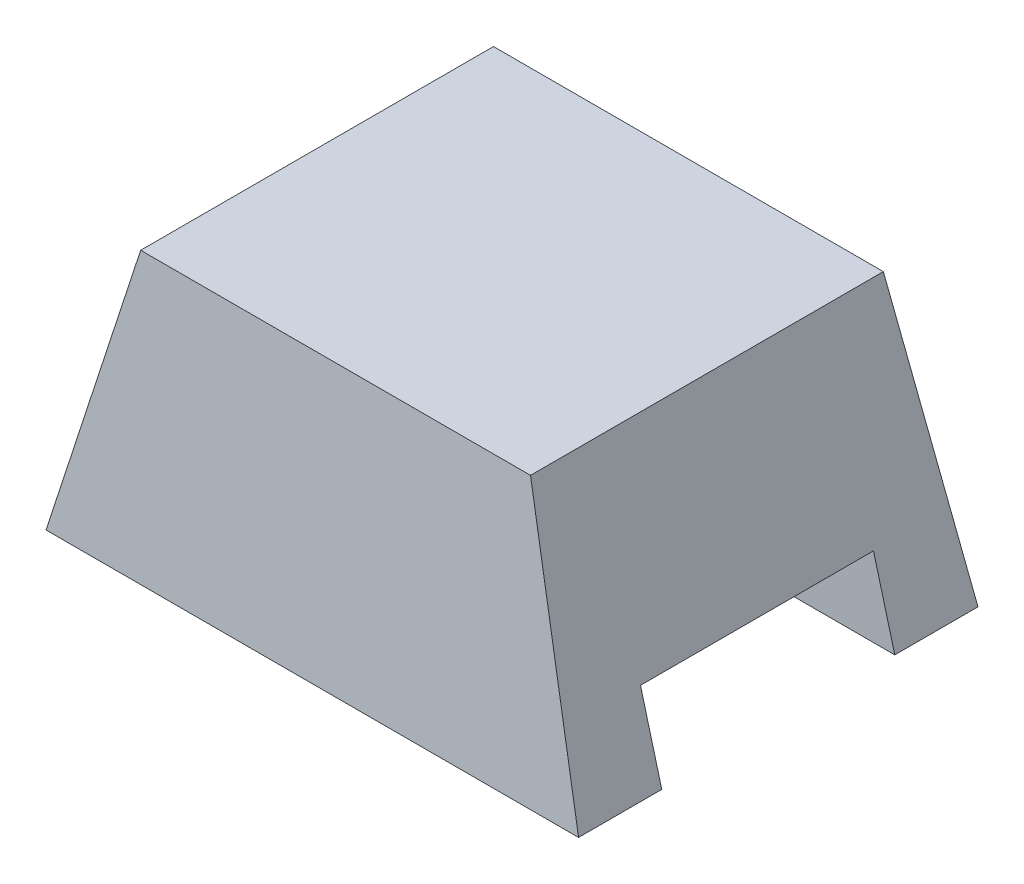
ISO-10303-21;
HEADER;
FILE_DESCRIPTION(('STEP AP214'),'2;1');
FILE_NAME('part.step','',(''),(''),'','','');
FILE_SCHEMA(('AUTOMOTIVE_DESIGN { 1 0 10303 214 1 1 1 1 }'));
ENDSEC;
DATA;
#1=APPLICATION_CONTEXT('core data for automotive mechanical design processes');
#2=APPLICATION_PROTOCOL_DEFINITION('international standard','automotive_design',2000,#1);
#3=PRODUCT_CONTEXT('',#1,'mechanical');
#4=PRODUCT('Part','Part','',(#3));
#5=PRODUCT_RELATED_PRODUCT_CATEGORY('part','',(#4));
#6=PRODUCT_DEFINITION_FORMATION('','',#4);
#7=PRODUCT_DEFINITION_CONTEXT('part definition',#1,'design');
#8=PRODUCT_DEFINITION('design','',#6,#7);
#9=PRODUCT_DEFINITION_SHAPE('','',#8);
#10=(LENGTH_UNIT() NAMED_UNIT(*) SI_UNIT(.MILLI.,.METRE.));
#11=(NAMED_UNIT(*) PLANE_ANGLE_UNIT() SI_UNIT($,.RADIAN.));
#12=(NAMED_UNIT(*) SI_UNIT($,.STERADIAN.) SOLID_ANGLE_UNIT());
#13=UNCERTAINTY_MEASURE_WITH_UNIT(LENGTH_MEASURE(1.E-05),#10,'distance_accuracy_value','');
#14=(GEOMETRIC_REPRESENTATION_CONTEXT(3) GLOBAL_UNCERTAINTY_ASSIGNED_CONTEXT((#13)) GLOBAL_UNIT_ASSIGNED_CONTEXT((#10,
#11,#12)) REPRESENTATION_CONTEXT('',''));
#15=CARTESIAN_POINT('',(0.,0.,0.));
#16=DIRECTION('',(0.,0.,1.));
#17=DIRECTION('',(1.,0.,0.));
#18=AXIS2_PLACEMENT_3D('',#15,#16,#17);
#19=CARTESIAN_POINT('',(0.,0.,60.));
#20=DIRECTION('',(0.,1.,0.));
#21=DIRECTION('',(0.,0.,1.));
#22=AXIS2_PLACEMENT_3D('',#19,#20,#21);
#23=PLANE('',#22);
#24=DIRECTION('',(0.,0.,-1.));
#25=VECTOR('',#24,1.);
#26=CARTESIAN_POINT('',(0.,0.,60.));
#27=LINE('',#26,#25);
#28=CARTESIAN_POINT('',(0.,0.,60.));
#29=VERTEX_POINT('',#28);
#30=CARTESIAN_POINT('',(0.,0.,47.5));
#31=VERTEX_POINT('',#30);
#32=EDGE_CURVE('E102',#29,#31,#27,.T.);
#33=ORIENTED_EDGE('',*,*,#32,.T.);
#34=DIRECTION('',(1.,0.,0.));
#35=VECTOR('',#34,1.);
#36=CARTESIAN_POINT('',(0.,0.,47.5));
#37=LINE('',#36,#35);
#38=CARTESIAN_POINT('',(80.,0.,47.5));
#39=VERTEX_POINT('',#38);
#40=EDGE_CURVE('E11',#31,#39,#37,.T.);
#41=ORIENTED_EDGE('',*,*,#40,.T.);
#42=DIRECTION('',(0.,0.,-1.));
#43=VECTOR('',#42,1.);
#44=CARTESIAN_POINT('',(80.,0.,60.));
#45=LINE('',#44,#43);
#46=CARTESIAN_POINT('',(80.,0.,60.));
#47=VERTEX_POINT('',#46);
#48=EDGE_CURVE('E117',#47,#39,#45,.T.);
#49=ORIENTED_EDGE('',*,*,#48,.F.);
#50=DIRECTION('',(1.,0.,0.));
#51=VECTOR('',#50,1.);
#52=CARTESIAN_POINT('',(0.,0.,60.));
#53=LINE('',#52,#51);
#54=EDGE_CURVE('E57',#29,#47,#53,.T.);
#55=ORIENTED_EDGE('',*,*,#54,.F.);
#56=EDGE_LOOP('',(#33,#41,#49,#55));
#57=FACE_BOUND('',#56,.T.);
#58=ADVANCED_FACE('F33',(#57),#23,.F.);
#59=CARTESIAN_POINT('',(80.,0.,60.));
#60=DIRECTION('',(0.965925826289068,0.258819045102521,0.));
#61=DIRECTION('',(-0.258819045102521,0.965925826289068,0.));
#62=AXIS2_PLACEMENT_3D('',#59,#60,#61);
#63=PLANE('',#62);
#64=ORIENTED_EDGE('',*,*,#48,.T.);
#65=DIRECTION('',(0.258819045102521,-0.965925826289068,0.));
#66=VECTOR('',#65,1.);
#67=CARTESIAN_POINT('',(80.,0.,47.5));
#68=LINE('',#67,#66);
#69=CARTESIAN_POINT('',(76.8005633720568,11.9404600510809,47.5));
#70=VERTEX_POINT('',#69);
#71=EDGE_CURVE('E155',#39,#70,#68,.F.);
#72=ORIENTED_EDGE('',*,*,#71,.T.);
#73=DIRECTION('',(0.,0.,1.));
#74=VECTOR('',#73,1.);
#75=CARTESIAN_POINT('',(76.8005633720568,11.9404600510809,60.));
#76=LINE('',#75,#74);
#77=CARTESIAN_POINT('',(76.8005633720568,11.9404600510809,12.5));
#78=VERTEX_POINT('',#77);
#79=EDGE_CURVE('E109',#70,#78,#76,.F.);
#80=ORIENTED_EDGE('',*,*,#79,.T.);
#81=DIRECTION('',(-0.258819045102521,0.965925826289068,0.));
#82=VECTOR('',#81,1.);
#83=CARTESIAN_POINT('',(80.,0.,12.5));
#84=LINE('',#83,#82);
#85=CARTESIAN_POINT('',(80.,0.,12.5));
#86=VERTEX_POINT('',#85);
#87=EDGE_CURVE('E151',#78,#86,#84,.F.);
#88=ORIENTED_EDGE('',*,*,#87,.T.);
#89=CARTESIAN_POINT('',(80.,0.,0.));
#90=VERTEX_POINT('',#89);
#91=EDGE_CURVE('E115',#86,#90,#45,.T.);
#92=ORIENTED_EDGE('',*,*,#91,.T.);
#93=DIRECTION('',(-0.257899784197096,0.962495097884607,0.0842074097641779));
#94=VECTOR('',#93,1.);
#95=CARTESIAN_POINT('',(78.6969756316413,4.8629531462149,0.425453271551524));
#96=LINE('',#95,#94);
#97=CARTESIAN_POINT('',(69.2820323027551,40.,3.49954654103696));
#98=VERTEX_POINT('',#97);
#99=EDGE_CURVE('E100',#90,#98,#96,.T.);
#100=ORIENTED_EDGE('',*,*,#99,.T.);
#101=DIRECTION('',(0.,0.,1.));
#102=VECTOR('',#101,1.);
#103=CARTESIAN_POINT('',(69.2820323027551,40.,60.));
#104=LINE('',#103,#102);
#105=CARTESIAN_POINT('',(69.2820323027551,40.,56.500453458963));
#106=VERTEX_POINT('',#105);
#107=EDGE_CURVE('E85',#106,#98,#104,.F.);
#108=ORIENTED_EDGE('',*,*,#107,.F.);
#109=DIRECTION('',(0.257899784197096,-0.962495097884607,0.0842074097641779));
#110=VECTOR('',#109,1.);
#111=CARTESIAN_POINT('',(80.,0.,60.));
#112=LINE('',#111,#110);
#113=EDGE_CURVE('E91',#47,#106,#112,.F.);
#114=ORIENTED_EDGE('',*,*,#113,.F.);
#115=EDGE_LOOP('',(#64,#72,#80,#88,#92,#100,#108,#114));
#116=FACE_BOUND('',#115,.T.);
#117=ADVANCED_FACE('F98',(#116),#63,.T.);
#118=CARTESIAN_POINT('',(80.,40.,60.));
#119=DIRECTION('',(0.,-1.,0.));
#120=DIRECTION('',(1.,0.,0.));
#121=AXIS2_PLACEMENT_3D('',#118,#119,#120);
#122=PLANE('',#121);
#123=DIRECTION('',(1.,0.,0.));
#124=VECTOR('',#123,1.);
#125=CARTESIAN_POINT('',(80.,40.,3.49954654103696));
#126=LINE('',#125,#124);
#127=CARTESIAN_POINT('',(10.7179676972449,40.,3.49954654103696));
#128=VERTEX_POINT('',#127);
#129=EDGE_CURVE('E108',#98,#128,#126,.F.);
#130=ORIENTED_EDGE('',*,*,#129,.T.);
#131=DIRECTION('',(0.,0.,1.));
#132=VECTOR('',#131,1.);
#133=CARTESIAN_POINT('',(10.7179676972449,40.,60.));
#134=LINE('',#133,#132);
#135=CARTESIAN_POINT('',(10.7179676972449,40.,56.500453458963));
#136=VERTEX_POINT('',#135);
#137=EDGE_CURVE('E88',#136,#128,#134,.F.);
#138=ORIENTED_EDGE('',*,*,#137,.F.);
#139=DIRECTION('',(-1.,0.,0.));
#140=VECTOR('',#139,1.);
#141=CARTESIAN_POINT('',(80.,40.,56.500453458963));
#142=LINE('',#141,#140);
#143=EDGE_CURVE('E82',#106,#136,#142,.T.);
#144=ORIENTED_EDGE('',*,*,#143,.F.);
#145=ORIENTED_EDGE('',*,*,#107,.T.);
#146=EDGE_LOOP('',(#130,#138,#144,#145));
#147=FACE_BOUND('',#146,.T.);
#148=ADVANCED_FACE('F83',(#147),#122,.F.);
#149=CARTESIAN_POINT('',(0.,0.,60.));
#150=DIRECTION('',(-0.965925826289068,0.258819045102521,0.));
#151=DIRECTION('',(-0.258819045102521,-0.965925826289068,0.));
#152=AXIS2_PLACEMENT_3D('',#149,#150,#151);
#153=PLANE('',#152);
#154=DIRECTION('',(0.,0.,-1.));
#155=VECTOR('',#154,1.);
#156=CARTESIAN_POINT('',(8.12977724621972,30.3407417371093,47.5));
#157=LINE('',#156,#155);
#158=CARTESIAN_POINT('',(8.12977724621972,30.3407417371093,47.5));
#159=VERTEX_POINT('',#158);
#160=CARTESIAN_POINT('',(8.12977724621972,30.3407417371093,12.5));
#161=VERTEX_POINT('',#160);
#162=EDGE_CURVE('E141',#159,#161,#157,.T.);
#163=ORIENTED_EDGE('',*,*,#162,.F.);
#164=DIRECTION('',(0.258819045102521,0.965925826289068,0.));
#165=VECTOR('',#164,1.);
#166=CARTESIAN_POINT('',(0.,0.,47.5));
#167=LINE('',#166,#165);
#168=EDGE_CURVE('E138',#31,#159,#167,.T.);
#169=ORIENTED_EDGE('',*,*,#168,.F.);
#170=ORIENTED_EDGE('',*,*,#32,.F.);
#171=DIRECTION('',(0.257899784197096,0.962495097884607,-0.0842074097641779));
#172=VECTOR('',#171,1.);
#173=CARTESIAN_POINT('',(0.,0.,60.));
#174=LINE('',#173,#172);
#175=EDGE_CURVE('E90',#136,#29,#174,.F.);
#176=ORIENTED_EDGE('',*,*,#175,.F.);
#177=ORIENTED_EDGE('',*,*,#137,.T.);
#178=DIRECTION('',(-0.257899784197096,-0.962495097884607,-0.0842074097641779));
#179=VECTOR('',#178,1.);
#180=CARTESIAN_POINT('',(1.30302436835867,4.8629531462149,0.425453271551524));
#181=LINE('',#180,#179);
#182=CARTESIAN_POINT('',(0.,0.,0.));
#183=VERTEX_POINT('',#182);
#184=EDGE_CURVE('E111',#128,#183,#181,.T.);
#185=ORIENTED_EDGE('',*,*,#184,.T.);
#186=CARTESIAN_POINT('',(0.,0.,12.5));
#187=VERTEX_POINT('',#186);
#188=EDGE_CURVE('E122',#187,#183,#27,.T.);
#189=ORIENTED_EDGE('',*,*,#188,.F.);
#190=DIRECTION('',(-0.258819045102521,-0.965925826289068,0.));
#191=VECTOR('',#190,1.);
#192=CARTESIAN_POINT('',(8.12977724621972,30.3407417371093,12.5));
#193=LINE('',#192,#191);
#194=EDGE_CURVE('E48',#161,#187,#193,.T.);
#195=ORIENTED_EDGE('',*,*,#194,.F.);
#196=EDGE_LOOP('',(#163,#169,#170,#176,#177,#185,#189,#195));
#197=FACE_BOUND('',#196,.T.);
#198=ADVANCED_FACE('F136',(#197),#153,.T.);
#199=ORIENTED_EDGE('',*,*,#91,.F.);
#200=DIRECTION('',(-1.,0.,0.));
#201=VECTOR('',#200,1.);
#202=CARTESIAN_POINT('',(0.,0.,12.5));
#203=LINE('',#202,#201);
#204=EDGE_CURVE('E41',#86,#187,#203,.T.);
#205=ORIENTED_EDGE('',*,*,#204,.T.);
#206=ORIENTED_EDGE('',*,*,#188,.T.);
#207=DIRECTION('',(1.,0.,0.));
#208=VECTOR('',#207,1.);
#209=CARTESIAN_POINT('',(0.,0.,0.));
#210=LINE('',#209,#208);
#211=EDGE_CURVE('E96',#183,#90,#210,.T.);
#212=ORIENTED_EDGE('',*,*,#211,.T.);
#213=EDGE_LOOP('',(#199,#205,#206,#212));
#214=FACE_BOUND('',#213,.T.);
#215=ADVANCED_FACE('F177',(#214),#23,.F.);
#216=CARTESIAN_POINT('',(0.,0.,60.));
#217=DIRECTION('',(0.,0.0871557427476584,0.996194698091746));
#218=DIRECTION('',(0.,-0.996194698091746,0.0871557427476584));
#219=AXIS2_PLACEMENT_3D('',#216,#217,#218);
#220=PLANE('',#219);
#221=ORIENTED_EDGE('',*,*,#113,.T.);
#222=ORIENTED_EDGE('',*,*,#143,.T.);
#223=ORIENTED_EDGE('',*,*,#175,.T.);
#224=ORIENTED_EDGE('',*,*,#54,.T.);
#225=EDGE_LOOP('',(#221,#222,#223,#224));
#226=FACE_BOUND('',#225,.T.);
#227=ADVANCED_FACE('F35',(#226),#220,.T.);
#228=CARTESIAN_POINT('',(0.,0.,0.));
#229=DIRECTION('',(0.,0.0871557427476584,-0.996194698091746));
#230=DIRECTION('',(0.,0.996194698091746,0.0871557427476584));
#231=AXIS2_PLACEMENT_3D('',#228,#229,#230);
#232=PLANE('',#231);
#233=ORIENTED_EDGE('',*,*,#99,.F.);
#234=ORIENTED_EDGE('',*,*,#211,.F.);
#235=ORIENTED_EDGE('',*,*,#184,.F.);
#236=ORIENTED_EDGE('',*,*,#129,.F.);
#237=EDGE_LOOP('',(#233,#234,#235,#236));
#238=FACE_BOUND('',#237,.T.);
#239=ADVANCED_FACE('F176',(#238),#232,.T.);
#240=CARTESIAN_POINT('',(121.143098922041,0.0589134601143154,47.5));
#241=DIRECTION('',(0.258819045102521,0.965925826289068,0.));
#242=DIRECTION('',(-0.965925826289068,0.258819045102521,0.));
#243=AXIS2_PLACEMENT_3D('',#240,#241,#242);
#244=PLANE('',#243);
#245=DIRECTION('',(-0.965925826289068,0.258819045102521,0.));
#246=VECTOR('',#245,1.);
#247=CARTESIAN_POINT('',(121.143098922041,0.0589134601143154,47.5));
#248=LINE('',#247,#246);
#249=EDGE_CURVE('E148',#70,#159,#248,.T.);
#250=ORIENTED_EDGE('',*,*,#249,.T.);
#251=ORIENTED_EDGE('',*,*,#162,.T.);
#252=DIRECTION('',(-0.965925826289068,0.258819045102521,0.));
#253=VECTOR('',#252,1.);
#254=CARTESIAN_POINT('',(121.143098922041,0.0589134601143085,12.5));
#255=LINE('',#254,#253);
#256=EDGE_CURVE('E149',#78,#161,#255,.T.);
#257=ORIENTED_EDGE('',*,*,#256,.F.);
#258=ORIENTED_EDGE('',*,*,#79,.F.);
#259=EDGE_LOOP('',(#250,#251,#257,#258));
#260=FACE_BOUND('',#259,.T.);
#261=ADVANCED_FACE('F166',(#260),#244,.F.);
#262=CARTESIAN_POINT('',(113.013321675821,-30.281828276995,47.5));
#263=DIRECTION('',(0.,0.,1.));
#264=DIRECTION('',(1.,0.,0.));
#265=AXIS2_PLACEMENT_3D('',#262,#263,#264);
#266=PLANE('',#265);
#267=ORIENTED_EDGE('',*,*,#40,.F.);
#268=ORIENTED_EDGE('',*,*,#168,.T.);
#269=ORIENTED_EDGE('',*,*,#249,.F.);
#270=ORIENTED_EDGE('',*,*,#71,.F.);
#271=EDGE_LOOP('',(#267,#268,#269,#270));
#272=FACE_BOUND('',#271,.T.);
#273=ADVANCED_FACE('F168',(#272),#266,.F.);
#274=CARTESIAN_POINT('',(121.143098922041,0.0589134601143085,12.5));
#275=DIRECTION('',(0.,0.,-1.));
#276=DIRECTION('',(0.,1.,0.));
#277=AXIS2_PLACEMENT_3D('',#274,#275,#276);
#278=PLANE('',#277);
#279=ORIENTED_EDGE('',*,*,#256,.T.);
#280=ORIENTED_EDGE('',*,*,#194,.T.);
#281=ORIENTED_EDGE('',*,*,#204,.F.);
#282=ORIENTED_EDGE('',*,*,#87,.F.);
#283=EDGE_LOOP('',(#279,#280,#281,#282));
#284=FACE_BOUND('',#283,.T.);
#285=ADVANCED_FACE('F172',(#284),#278,.F.);
#286=CLOSED_SHELL('',(#58,#117,#148,#198,#215,#227,#239,#261,#273,#285));
#287=MANIFOLD_SOLID_BREP('B2',#286);
#288=ADVANCED_BREP_SHAPE_REPRESENTATION('',(#18,#287),#14);
#289=SHAPE_DEFINITION_REPRESENTATION(#9,#288);
ENDSEC;
END-ISO-10303-21;
